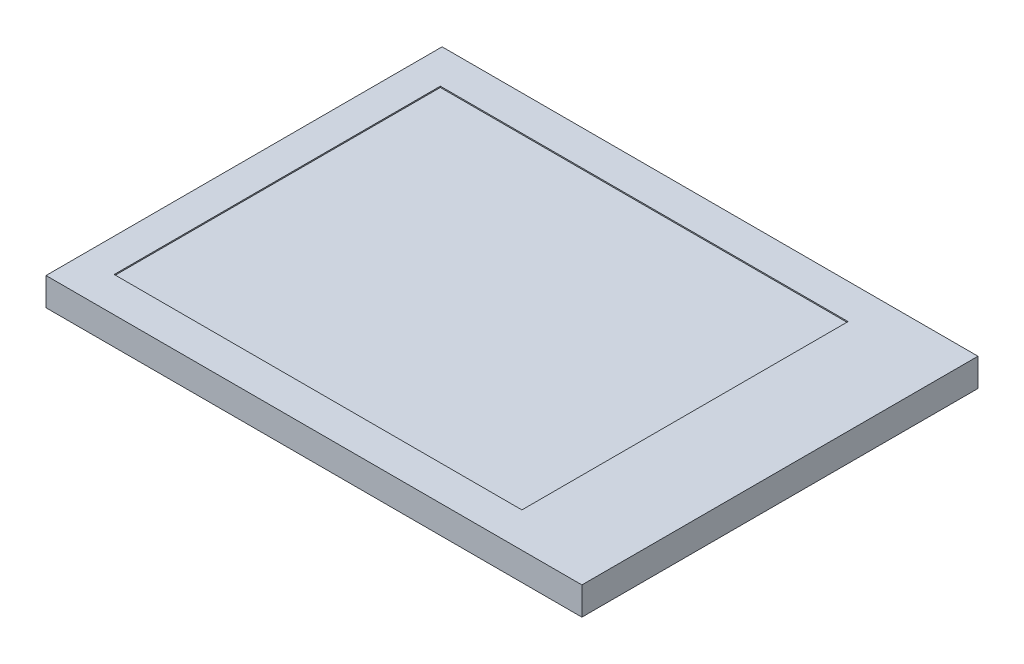
ISO-10303-21;
HEADER;
FILE_DESCRIPTION(('STEP AP214'),'2;1');
FILE_NAME('part.step','',(''),(''),'','','');
FILE_SCHEMA(('AUTOMOTIVE_DESIGN { 1 0 10303 214 1 1 1 1 }'));
ENDSEC;
DATA;
#1=APPLICATION_CONTEXT('core data for automotive mechanical design processes');
#2=APPLICATION_PROTOCOL_DEFINITION('international standard','automotive_design',2000,#1);
#3=PRODUCT_CONTEXT('',#1,'mechanical');
#4=PRODUCT('Part','Part','',(#3));
#5=PRODUCT_RELATED_PRODUCT_CATEGORY('part','',(#4));
#6=PRODUCT_DEFINITION_FORMATION('','',#4);
#7=PRODUCT_DEFINITION_CONTEXT('part definition',#1,'design');
#8=PRODUCT_DEFINITION('design','',#6,#7);
#9=PRODUCT_DEFINITION_SHAPE('','',#8);
#10=(LENGTH_UNIT() NAMED_UNIT(*) SI_UNIT(.MILLI.,.METRE.));
#11=(NAMED_UNIT(*) PLANE_ANGLE_UNIT() SI_UNIT($,.RADIAN.));
#12=(NAMED_UNIT(*) SI_UNIT($,.STERADIAN.) SOLID_ANGLE_UNIT());
#13=UNCERTAINTY_MEASURE_WITH_UNIT(LENGTH_MEASURE(1.E-05),#10,'distance_accuracy_value','');
#14=(GEOMETRIC_REPRESENTATION_CONTEXT(3) GLOBAL_UNCERTAINTY_ASSIGNED_CONTEXT((#13)) GLOBAL_UNIT_ASSIGNED_CONTEXT((#10,
#11,#12)) REPRESENTATION_CONTEXT('',''));
#15=CARTESIAN_POINT('',(0.,0.,0.));
#16=DIRECTION('',(0.,0.,1.));
#17=DIRECTION('',(1.,0.,0.));
#18=AXIS2_PLACEMENT_3D('',#15,#16,#17);
#19=CARTESIAN_POINT('',(0.,2.4,0.));
#20=DIRECTION('',(1.,0.,0.));
#21=DIRECTION('',(0.,0.,-1.));
#22=AXIS2_PLACEMENT_3D('',#19,#20,#21);
#23=PLANE('',#22);
#24=DIRECTION('',(0.,0.,1.));
#25=VECTOR('',#24,1.);
#26=CARTESIAN_POINT('',(0.,0.,0.));
#27=LINE('',#26,#25);
#28=CARTESIAN_POINT('',(0.,0.,-34.));
#29=VERTEX_POINT('',#28);
#30=CARTESIAN_POINT('',(0.,0.,0.));
#31=VERTEX_POINT('',#30);
#32=EDGE_CURVE('E151',#29,#31,#27,.T.);
#33=ORIENTED_EDGE('',*,*,#32,.T.);
#34=DIRECTION('',(0.,-1.,0.));
#35=VECTOR('',#34,1.);
#36=CARTESIAN_POINT('',(0.,2.4,0.));
#37=LINE('',#36,#35);
#38=CARTESIAN_POINT('',(0.,2.4,0.));
#39=VERTEX_POINT('',#38);
#40=EDGE_CURVE('E11',#39,#31,#37,.T.);
#41=ORIENTED_EDGE('',*,*,#40,.F.);
#42=DIRECTION('',(0.,0.,1.));
#43=VECTOR('',#42,1.);
#44=CARTESIAN_POINT('',(0.,2.4,0.));
#45=LINE('',#44,#43);
#46=CARTESIAN_POINT('',(0.,2.4,-34.));
#47=VERTEX_POINT('',#46);
#48=EDGE_CURVE('E155',#47,#39,#45,.T.);
#49=ORIENTED_EDGE('',*,*,#48,.F.);
#50=DIRECTION('',(0.,-1.,0.));
#51=VECTOR('',#50,1.);
#52=CARTESIAN_POINT('',(0.,2.4,-34.));
#53=LINE('',#52,#51);
#54=EDGE_CURVE('E161',#47,#29,#53,.T.);
#55=ORIENTED_EDGE('',*,*,#54,.T.);
#56=EDGE_LOOP('',(#33,#41,#49,#55));
#57=FACE_BOUND('',#56,.T.);
#58=ADVANCED_FACE('F43',(#57),#23,.F.);
#59=CARTESIAN_POINT('',(0.,2.4,0.));
#60=DIRECTION('',(0.,0.,-1.));
#61=DIRECTION('',(-1.,0.,0.));
#62=AXIS2_PLACEMENT_3D('',#59,#60,#61);
#63=PLANE('',#62);
#64=DIRECTION('',(1.,0.,0.));
#65=VECTOR('',#64,1.);
#66=CARTESIAN_POINT('',(0.,0.,0.));
#67=LINE('',#66,#65);
#68=CARTESIAN_POINT('',(46.,0.,0.));
#69=VERTEX_POINT('',#68);
#70=EDGE_CURVE('E164',#31,#69,#67,.T.);
#71=ORIENTED_EDGE('',*,*,#70,.T.);
#72=DIRECTION('',(0.,-1.,0.));
#73=VECTOR('',#72,1.);
#74=CARTESIAN_POINT('',(46.,2.4,0.));
#75=LINE('',#74,#73);
#76=CARTESIAN_POINT('',(46.,2.4,0.));
#77=VERTEX_POINT('',#76);
#78=EDGE_CURVE('E50',#77,#69,#75,.T.);
#79=ORIENTED_EDGE('',*,*,#78,.F.);
#80=DIRECTION('',(1.,0.,0.));
#81=VECTOR('',#80,1.);
#82=CARTESIAN_POINT('',(0.,2.4,0.));
#83=LINE('',#82,#81);
#84=EDGE_CURVE('E94',#39,#77,#83,.T.);
#85=ORIENTED_EDGE('',*,*,#84,.F.);
#86=ORIENTED_EDGE('',*,*,#40,.T.);
#87=EDGE_LOOP('',(#71,#79,#85,#86));
#88=FACE_BOUND('',#87,.T.);
#89=ADVANCED_FACE('F193',(#88),#63,.F.);
#90=CARTESIAN_POINT('',(46.,2.4,0.));
#91=DIRECTION('',(-1.,0.,0.));
#92=DIRECTION('',(0.,0.,1.));
#93=AXIS2_PLACEMENT_3D('',#90,#91,#92);
#94=PLANE('',#93);
#95=DIRECTION('',(0.,0.,-1.));
#96=VECTOR('',#95,1.);
#97=CARTESIAN_POINT('',(46.,0.,0.));
#98=LINE('',#97,#96);
#99=CARTESIAN_POINT('',(46.,0.,-34.));
#100=VERTEX_POINT('',#99);
#101=EDGE_CURVE('E166',#69,#100,#98,.T.);
#102=ORIENTED_EDGE('',*,*,#101,.T.);
#103=DIRECTION('',(0.,-1.,0.));
#104=VECTOR('',#103,1.);
#105=CARTESIAN_POINT('',(46.,2.4,-34.));
#106=LINE('',#105,#104);
#107=CARTESIAN_POINT('',(46.,2.4,-34.));
#108=VERTEX_POINT('',#107);
#109=EDGE_CURVE('E170',#108,#100,#106,.T.);
#110=ORIENTED_EDGE('',*,*,#109,.F.);
#111=DIRECTION('',(0.,0.,-1.));
#112=VECTOR('',#111,1.);
#113=CARTESIAN_POINT('',(46.,2.4,0.));
#114=LINE('',#113,#112);
#115=EDGE_CURVE('E158',#77,#108,#114,.T.);
#116=ORIENTED_EDGE('',*,*,#115,.F.);
#117=ORIENTED_EDGE('',*,*,#78,.T.);
#118=EDGE_LOOP('',(#102,#110,#116,#117));
#119=FACE_BOUND('',#118,.T.);
#120=ADVANCED_FACE('F175',(#119),#94,.F.);
#121=CARTESIAN_POINT('',(0.,2.4,-34.));
#122=DIRECTION('',(0.,0.,1.));
#123=DIRECTION('',(1.,0.,0.));
#124=AXIS2_PLACEMENT_3D('',#121,#122,#123);
#125=PLANE('',#124);
#126=DIRECTION('',(-1.,0.,0.));
#127=VECTOR('',#126,1.);
#128=CARTESIAN_POINT('',(0.,0.,-34.));
#129=LINE('',#128,#127);
#130=EDGE_CURVE('E87',#100,#29,#129,.T.);
#131=ORIENTED_EDGE('',*,*,#130,.T.);
#132=ORIENTED_EDGE('',*,*,#54,.F.);
#133=DIRECTION('',(-1.,0.,0.));
#134=VECTOR('',#133,1.);
#135=CARTESIAN_POINT('',(0.,2.4,-34.));
#136=LINE('',#135,#134);
#137=EDGE_CURVE('E66',#108,#47,#136,.T.);
#138=ORIENTED_EDGE('',*,*,#137,.F.);
#139=ORIENTED_EDGE('',*,*,#109,.T.);
#140=EDGE_LOOP('',(#131,#132,#138,#139));
#141=FACE_BOUND('',#140,.T.);
#142=ADVANCED_FACE('F183',(#141),#125,.F.);
#143=CARTESIAN_POINT('',(0.,2.4,0.));
#144=DIRECTION('',(0.,-1.,0.));
#145=DIRECTION('',(0.,0.,-1.));
#146=AXIS2_PLACEMENT_3D('',#143,#144,#145);
#147=PLANE('',#146);
#148=DIRECTION('',(1.,0.,0.));
#149=VECTOR('',#148,1.);
#150=CARTESIAN_POINT('',(2.85,2.4,-3.00000000000001));
#151=LINE('',#150,#149);
#152=CARTESIAN_POINT('',(2.85,2.4,-3.00000000000001));
#153=VERTEX_POINT('',#152);
#154=CARTESIAN_POINT('',(37.85,2.4,-3.00000000000001));
#155=VERTEX_POINT('',#154);
#156=EDGE_CURVE('E145',#153,#155,#151,.T.);
#157=ORIENTED_EDGE('',*,*,#156,.F.);
#158=DIRECTION('',(0.,0.,1.));
#159=VECTOR('',#158,1.);
#160=CARTESIAN_POINT('',(2.84999999999999,2.4,-31.));
#161=LINE('',#160,#159);
#162=CARTESIAN_POINT('',(2.84999999999999,2.4,-31.));
#163=VERTEX_POINT('',#162);
#164=EDGE_CURVE('E57',#163,#153,#161,.T.);
#165=ORIENTED_EDGE('',*,*,#164,.F.);
#166=DIRECTION('',(-1.,0.,0.));
#167=VECTOR('',#166,1.);
#168=CARTESIAN_POINT('',(2.84999999999999,2.4,-31.));
#169=LINE('',#168,#167);
#170=CARTESIAN_POINT('',(37.85,2.4,-31.));
#171=VERTEX_POINT('',#170);
#172=EDGE_CURVE('E136',#171,#163,#169,.T.);
#173=ORIENTED_EDGE('',*,*,#172,.F.);
#174=DIRECTION('',(0.,0.,-1.));
#175=VECTOR('',#174,1.);
#176=CARTESIAN_POINT('',(37.85,2.4,-31.));
#177=LINE('',#176,#175);
#178=EDGE_CURVE('E139',#155,#171,#177,.T.);
#179=ORIENTED_EDGE('',*,*,#178,.F.);
#180=EDGE_LOOP('',(#157,#165,#173,#179));
#181=FACE_BOUND('',#180,.T.);
#182=ORIENTED_EDGE('',*,*,#48,.T.);
#183=ORIENTED_EDGE('',*,*,#84,.T.);
#184=ORIENTED_EDGE('',*,*,#115,.T.);
#185=ORIENTED_EDGE('',*,*,#137,.T.);
#186=EDGE_LOOP('',(#182,#183,#184,#185));
#187=FACE_BOUND('',#186,.T.);
#188=ADVANCED_FACE('F185',(#181,#187),#147,.F.);
#189=CARTESIAN_POINT('',(0.,0.,0.));
#190=DIRECTION('',(0.,-1.,0.));
#191=DIRECTION('',(0.,0.,-1.));
#192=AXIS2_PLACEMENT_3D('',#189,#190,#191);
#193=PLANE('',#192);
#194=ORIENTED_EDGE('',*,*,#32,.F.);
#195=ORIENTED_EDGE('',*,*,#130,.F.);
#196=ORIENTED_EDGE('',*,*,#101,.F.);
#197=ORIENTED_EDGE('',*,*,#70,.F.);
#198=EDGE_LOOP('',(#194,#195,#196,#197));
#199=FACE_BOUND('',#198,.T.);
#200=ADVANCED_FACE('F179',(#199),#193,.T.);
#201=CARTESIAN_POINT('',(2.84999999999999,2.3,-31.));
#202=DIRECTION('',(-1.,0.,0.));
#203=DIRECTION('',(0.,0.,1.));
#204=AXIS2_PLACEMENT_3D('',#201,#202,#203);
#205=PLANE('',#204);
#206=ORIENTED_EDGE('',*,*,#164,.T.);
#207=DIRECTION('',(0.,1.,0.));
#208=VECTOR('',#207,1.);
#209=CARTESIAN_POINT('',(2.85,2.3,-3.00000000000001));
#210=LINE('',#209,#208);
#211=CARTESIAN_POINT('',(2.85,2.3,-3.00000000000001));
#212=VERTEX_POINT('',#211);
#213=EDGE_CURVE('E114',#212,#153,#210,.T.);
#214=ORIENTED_EDGE('',*,*,#213,.F.);
#215=DIRECTION('',(0.,0.,1.));
#216=VECTOR('',#215,1.);
#217=CARTESIAN_POINT('',(2.84999999999999,2.3,-31.));
#218=LINE('',#217,#216);
#219=CARTESIAN_POINT('',(2.84999999999999,2.3,-31.));
#220=VERTEX_POINT('',#219);
#221=EDGE_CURVE('E118',#220,#212,#218,.T.);
#222=ORIENTED_EDGE('',*,*,#221,.F.);
#223=DIRECTION('',(0.,1.,0.));
#224=VECTOR('',#223,1.);
#225=CARTESIAN_POINT('',(2.84999999999999,2.3,-31.));
#226=LINE('',#225,#224);
#227=EDGE_CURVE('E149',#220,#163,#226,.T.);
#228=ORIENTED_EDGE('',*,*,#227,.T.);
#229=EDGE_LOOP('',(#206,#214,#222,#228));
#230=FACE_BOUND('',#229,.T.);
#231=ADVANCED_FACE('F116',(#230),#205,.F.);
#232=CARTESIAN_POINT('',(2.84999999999999,2.3,-31.));
#233=DIRECTION('',(0.,0.,-1.));
#234=DIRECTION('',(-1.,0.,0.));
#235=AXIS2_PLACEMENT_3D('',#232,#233,#234);
#236=PLANE('',#235);
#237=ORIENTED_EDGE('',*,*,#172,.T.);
#238=ORIENTED_EDGE('',*,*,#227,.F.);
#239=DIRECTION('',(-1.,0.,0.));
#240=VECTOR('',#239,1.);
#241=CARTESIAN_POINT('',(2.84999999999999,2.3,-31.));
#242=LINE('',#241,#240);
#243=CARTESIAN_POINT('',(37.85,2.3,-31.));
#244=VERTEX_POINT('',#243);
#245=EDGE_CURVE('E124',#244,#220,#242,.T.);
#246=ORIENTED_EDGE('',*,*,#245,.F.);
#247=DIRECTION('',(0.,1.,0.));
#248=VECTOR('',#247,1.);
#249=CARTESIAN_POINT('',(37.85,2.3,-31.));
#250=LINE('',#249,#248);
#251=EDGE_CURVE('E152',#244,#171,#250,.T.);
#252=ORIENTED_EDGE('',*,*,#251,.T.);
#253=EDGE_LOOP('',(#237,#238,#246,#252));
#254=FACE_BOUND('',#253,.T.);
#255=ADVANCED_FACE('F236',(#254),#236,.F.);
#256=CARTESIAN_POINT('',(37.85,2.3,-31.));
#257=DIRECTION('',(1.,0.,0.));
#258=DIRECTION('',(0.,0.,-1.));
#259=AXIS2_PLACEMENT_3D('',#256,#257,#258);
#260=PLANE('',#259);
#261=ORIENTED_EDGE('',*,*,#178,.T.);
#262=ORIENTED_EDGE('',*,*,#251,.F.);
#263=DIRECTION('',(0.,0.,-1.));
#264=VECTOR('',#263,1.);
#265=CARTESIAN_POINT('',(37.85,2.3,-31.));
#266=LINE('',#265,#264);
#267=CARTESIAN_POINT('',(37.85,2.3,-3.00000000000001));
#268=VERTEX_POINT('',#267);
#269=EDGE_CURVE('E132',#268,#244,#266,.T.);
#270=ORIENTED_EDGE('',*,*,#269,.F.);
#271=DIRECTION('',(0.,1.,0.));
#272=VECTOR('',#271,1.);
#273=CARTESIAN_POINT('',(37.85,2.3,-3.00000000000001));
#274=LINE('',#273,#272);
#275=EDGE_CURVE('E123',#268,#155,#274,.T.);
#276=ORIENTED_EDGE('',*,*,#275,.T.);
#277=EDGE_LOOP('',(#261,#262,#270,#276));
#278=FACE_BOUND('',#277,.T.);
#279=ADVANCED_FACE('F246',(#278),#260,.F.);
#280=CARTESIAN_POINT('',(2.85,2.3,-3.00000000000001));
#281=DIRECTION('',(0.,0.,1.));
#282=DIRECTION('',(1.,0.,0.));
#283=AXIS2_PLACEMENT_3D('',#280,#281,#282);
#284=PLANE('',#283);
#285=ORIENTED_EDGE('',*,*,#156,.T.);
#286=ORIENTED_EDGE('',*,*,#275,.F.);
#287=DIRECTION('',(1.,0.,0.));
#288=VECTOR('',#287,1.);
#289=CARTESIAN_POINT('',(2.85,2.3,-3.00000000000001));
#290=LINE('',#289,#288);
#291=EDGE_CURVE('E127',#212,#268,#290,.T.);
#292=ORIENTED_EDGE('',*,*,#291,.F.);
#293=ORIENTED_EDGE('',*,*,#213,.T.);
#294=EDGE_LOOP('',(#285,#286,#292,#293));
#295=FACE_BOUND('',#294,.T.);
#296=ADVANCED_FACE('F128',(#295),#284,.F.);
#297=CARTESIAN_POINT('',(0.,2.3,0.));
#298=DIRECTION('',(0.,1.,0.));
#299=DIRECTION('',(0.,0.,1.));
#300=AXIS2_PLACEMENT_3D('',#297,#298,#299);
#301=PLANE('',#300);
#302=ORIENTED_EDGE('',*,*,#221,.T.);
#303=ORIENTED_EDGE('',*,*,#291,.T.);
#304=ORIENTED_EDGE('',*,*,#269,.T.);
#305=ORIENTED_EDGE('',*,*,#245,.T.);
#306=EDGE_LOOP('',(#302,#303,#304,#305));
#307=FACE_BOUND('',#306,.T.);
#308=ADVANCED_FACE('F134',(#307),#301,.T.);
#309=CLOSED_SHELL('',(#58,#89,#120,#142,#188,#200,#231,#255,#279,#296,#308));
#310=MANIFOLD_SOLID_BREP('B2',#309);
#311=ADVANCED_BREP_SHAPE_REPRESENTATION('',(#18,#310),#14);
#312=SHAPE_DEFINITION_REPRESENTATION(#9,#311);
ENDSEC;
END-ISO-10303-21;
